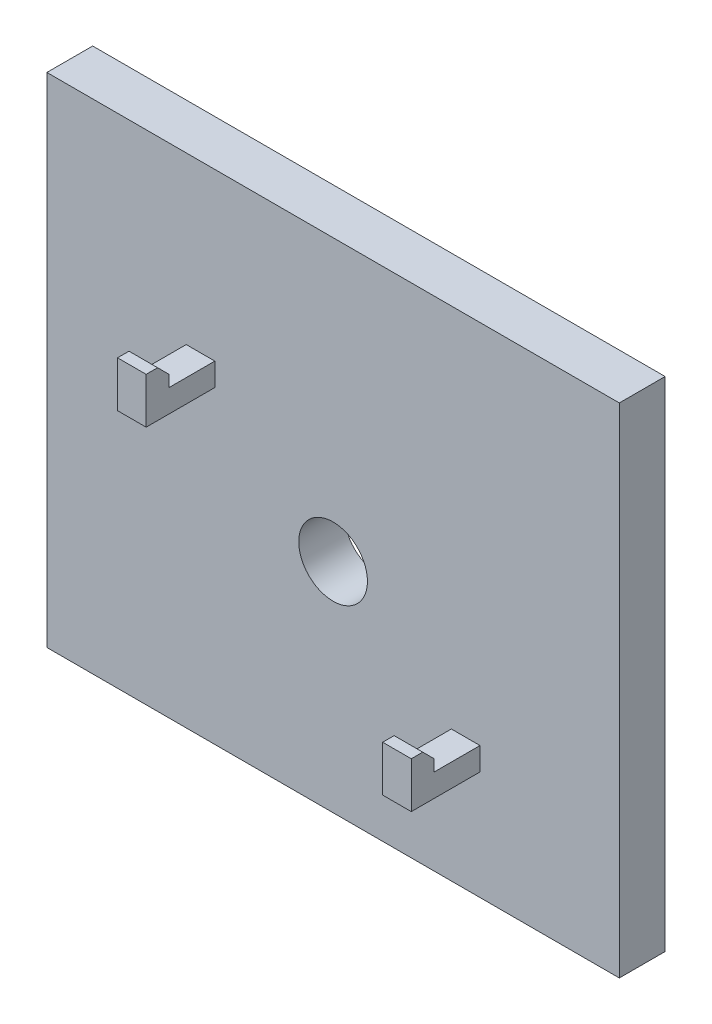
ISO-10303-21;
HEADER;
FILE_DESCRIPTION(('STEP AP214'),'2;1');
FILE_NAME('part.step','',(''),(''),'','','');
FILE_SCHEMA(('AUTOMOTIVE_DESIGN { 1 0 10303 214 1 1 1 1 }'));
ENDSEC;
DATA;
#1=APPLICATION_CONTEXT('core data for automotive mechanical design processes');
#2=APPLICATION_PROTOCOL_DEFINITION('international standard','automotive_design',2000,#1);
#3=PRODUCT_CONTEXT('',#1,'mechanical');
#4=PRODUCT('Part','Part','',(#3));
#5=PRODUCT_RELATED_PRODUCT_CATEGORY('part','',(#4));
#6=PRODUCT_DEFINITION_FORMATION('','',#4);
#7=PRODUCT_DEFINITION_CONTEXT('part definition',#1,'design');
#8=PRODUCT_DEFINITION('design','',#6,#7);
#9=PRODUCT_DEFINITION_SHAPE('','',#8);
#10=(LENGTH_UNIT() NAMED_UNIT(*) SI_UNIT(.MILLI.,.METRE.));
#11=(NAMED_UNIT(*) PLANE_ANGLE_UNIT() SI_UNIT($,.RADIAN.));
#12=(NAMED_UNIT(*) SI_UNIT($,.STERADIAN.) SOLID_ANGLE_UNIT());
#13=UNCERTAINTY_MEASURE_WITH_UNIT(LENGTH_MEASURE(1.E-05),#10,'distance_accuracy_value','');
#14=(GEOMETRIC_REPRESENTATION_CONTEXT(3) GLOBAL_UNCERTAINTY_ASSIGNED_CONTEXT((#13)) GLOBAL_UNIT_ASSIGNED_CONTEXT((#10,
#11,#12)) REPRESENTATION_CONTEXT('',''));
#15=CARTESIAN_POINT('',(0.,0.,0.));
#16=DIRECTION('',(0.,0.,1.));
#17=DIRECTION('',(1.,0.,0.));
#18=AXIS2_PLACEMENT_3D('',#15,#16,#17);
#19=CARTESIAN_POINT('',(12.83,-10.25,10.));
#20=DIRECTION('',(0.,-1.,0.));
#21=DIRECTION('',(0.,0.,-1.));
#22=AXIS2_PLACEMENT_3D('',#19,#20,#21);
#23=PLANE('',#22);
#24=DIRECTION('',(-1.,0.,0.));
#25=VECTOR('',#24,1.);
#26=CARTESIAN_POINT('',(10.33,-10.25,8.));
#27=LINE('',#26,#25);
#28=CARTESIAN_POINT('',(12.83,-10.25,8.));
#29=VERTEX_POINT('',#28);
#30=CARTESIAN_POINT('',(10.33,-10.25,8.));
#31=VERTEX_POINT('',#30);
#32=EDGE_CURVE('E167',#29,#31,#27,.T.);
#33=ORIENTED_EDGE('',*,*,#32,.F.);
#34=DIRECTION('',(0.,0.,-1.));
#35=VECTOR('',#34,1.);
#36=CARTESIAN_POINT('',(12.83,-10.25,10.));
#37=LINE('',#36,#35);
#38=CARTESIAN_POINT('',(12.83,-10.25,4.));
#39=VERTEX_POINT('',#38);
#40=EDGE_CURVE('E226',#29,#39,#37,.T.);
#41=ORIENTED_EDGE('',*,*,#40,.T.);
#42=DIRECTION('',(-1.,0.,0.));
#43=VECTOR('',#42,1.);
#44=CARTESIAN_POINT('',(12.83,-10.25,4.));
#45=LINE('',#44,#43);
#46=CARTESIAN_POINT('',(10.33,-10.25,4.));
#47=VERTEX_POINT('',#46);
#48=EDGE_CURVE('E214',#39,#47,#45,.T.);
#49=ORIENTED_EDGE('',*,*,#48,.T.);
#50=DIRECTION('',(0.,0.,-1.));
#51=VECTOR('',#50,1.);
#52=CARTESIAN_POINT('',(10.33,-10.25,10.));
#53=LINE('',#52,#51);
#54=EDGE_CURVE('E224',#31,#47,#53,.T.);
#55=ORIENTED_EDGE('',*,*,#54,.F.);
#56=EDGE_LOOP('',(#33,#41,#49,#55));
#57=FACE_BOUND('',#56,.T.);
#58=ADVANCED_FACE('F33',(#57),#23,.F.);
#59=CARTESIAN_POINT('',(-12.83,7.25,10.));
#60=DIRECTION('',(0.,-1.,0.));
#61=DIRECTION('',(0.,0.,-1.));
#62=AXIS2_PLACEMENT_3D('',#59,#60,#61);
#63=PLANE('',#62);
#64=DIRECTION('',(-1.,0.,0.));
#65=VECTOR('',#64,1.);
#66=CARTESIAN_POINT('',(-12.83,7.25,8.));
#67=LINE('',#66,#65);
#68=CARTESIAN_POINT('',(-10.33,7.25,8.));
#69=VERTEX_POINT('',#68);
#70=CARTESIAN_POINT('',(-12.83,7.25,8.));
#71=VERTEX_POINT('',#70);
#72=EDGE_CURVE('E192',#69,#71,#67,.T.);
#73=ORIENTED_EDGE('',*,*,#72,.F.);
#74=DIRECTION('',(0.,0.,-1.));
#75=VECTOR('',#74,1.);
#76=CARTESIAN_POINT('',(-10.33,7.25,10.));
#77=LINE('',#76,#75);
#78=CARTESIAN_POINT('',(-10.33,7.25,4.));
#79=VERTEX_POINT('',#78);
#80=EDGE_CURVE('E254',#69,#79,#77,.T.);
#81=ORIENTED_EDGE('',*,*,#80,.T.);
#82=DIRECTION('',(-1.,0.,0.));
#83=VECTOR('',#82,1.);
#84=CARTESIAN_POINT('',(-12.83,7.25,4.));
#85=LINE('',#84,#83);
#86=CARTESIAN_POINT('',(-12.83,7.25,4.));
#87=VERTEX_POINT('',#86);
#88=EDGE_CURVE('E239',#79,#87,#85,.T.);
#89=ORIENTED_EDGE('',*,*,#88,.T.);
#90=DIRECTION('',(0.,0.,-1.));
#91=VECTOR('',#90,1.);
#92=CARTESIAN_POINT('',(-12.83,7.25,10.));
#93=LINE('',#92,#91);
#94=EDGE_CURVE('E252',#71,#87,#93,.T.);
#95=ORIENTED_EDGE('',*,*,#94,.F.);
#96=EDGE_LOOP('',(#73,#81,#89,#95));
#97=FACE_BOUND('',#96,.T.);
#98=ADVANCED_FACE('F326',(#97),#63,.F.);
#99=CARTESIAN_POINT('',(0.,0.,4.));
#100=DIRECTION('',(0.,0.,-1.));
#101=DIRECTION('',(-1.,0.,0.));
#102=AXIS2_PLACEMENT_3D('',#99,#100,#101);
#103=PLANE('',#102);
#104=DIRECTION('',(0.,1.,0.));
#105=VECTOR('',#104,1.);
#106=CARTESIAN_POINT('',(-10.33,5.25,4.));
#107=LINE('',#106,#105);
#108=CARTESIAN_POINT('',(-10.33,5.25,4.));
#109=VERTEX_POINT('',#108);
#110=EDGE_CURVE('E228',#109,#79,#107,.T.);
#111=ORIENTED_EDGE('',*,*,#110,.F.);
#112=DIRECTION('',(1.,0.,0.));
#113=VECTOR('',#112,1.);
#114=CARTESIAN_POINT('',(-12.83,5.25,4.));
#115=LINE('',#114,#113);
#116=CARTESIAN_POINT('',(-12.83,5.25,4.));
#117=VERTEX_POINT('',#116);
#118=EDGE_CURVE('E232',#117,#109,#115,.T.);
#119=ORIENTED_EDGE('',*,*,#118,.F.);
#120=DIRECTION('',(0.,-1.,0.));
#121=VECTOR('',#120,1.);
#122=CARTESIAN_POINT('',(-12.83,5.25,4.));
#123=LINE('',#122,#121);
#124=EDGE_CURVE('E242',#87,#117,#123,.T.);
#125=ORIENTED_EDGE('',*,*,#124,.F.);
#126=ORIENTED_EDGE('',*,*,#88,.F.);
#127=EDGE_LOOP('',(#111,#119,#125,#126));
#128=FACE_BOUND('',#127,.T.);
#129=CARTESIAN_POINT('',(0.,-2.75,4.));
#130=DIRECTION('',(0.,0.,1.));
#131=DIRECTION('',(1.,0.,0.));
#132=AXIS2_PLACEMENT_3D('',#129,#130,#131);
#133=CIRCLE('',#132,3.);
#134=CARTESIAN_POINT('',(3.,-2.75,4.));
#135=VERTEX_POINT('',#134);
#136=EDGE_CURVE('E256',#135,#135,#133,.T.);
#137=ORIENTED_EDGE('',*,*,#136,.F.);
#138=EDGE_LOOP('',(#137));
#139=FACE_BOUND('',#138,.T.);
#140=DIRECTION('',(0.,1.,0.));
#141=VECTOR('',#140,1.);
#142=CARTESIAN_POINT('',(25.,-21.75,4.));
#143=LINE('',#142,#141);
#144=CARTESIAN_POINT('',(25.,-21.75,4.));
#145=VERTEX_POINT('',#144);
#146=CARTESIAN_POINT('',(25.,21.75,4.));
#147=VERTEX_POINT('',#146);
#148=EDGE_CURVE('E263',#145,#147,#143,.T.);
#149=ORIENTED_EDGE('',*,*,#148,.T.);
#150=DIRECTION('',(-1.,0.,0.));
#151=VECTOR('',#150,1.);
#152=CARTESIAN_POINT('',(-25.,21.75,4.));
#153=LINE('',#152,#151);
#154=CARTESIAN_POINT('',(-25.,21.75,4.));
#155=VERTEX_POINT('',#154);
#156=EDGE_CURVE('E266',#147,#155,#153,.T.);
#157=ORIENTED_EDGE('',*,*,#156,.T.);
#158=DIRECTION('',(0.,-1.,0.));
#159=VECTOR('',#158,1.);
#160=CARTESIAN_POINT('',(-25.,-21.75,4.));
#161=LINE('',#160,#159);
#162=CARTESIAN_POINT('',(-25.,-21.75,4.));
#163=VERTEX_POINT('',#162);
#164=EDGE_CURVE('E269',#155,#163,#161,.T.);
#165=ORIENTED_EDGE('',*,*,#164,.T.);
#166=DIRECTION('',(1.,0.,0.));
#167=VECTOR('',#166,1.);
#168=CARTESIAN_POINT('',(-25.,-21.75,4.));
#169=LINE('',#168,#167);
#170=EDGE_CURVE('E271',#163,#145,#169,.T.);
#171=ORIENTED_EDGE('',*,*,#170,.T.);
#172=EDGE_LOOP('',(#149,#157,#165,#171));
#173=FACE_BOUND('',#172,.T.);
#174=DIRECTION('',(0.,1.,0.));
#175=VECTOR('',#174,1.);
#176=CARTESIAN_POINT('',(12.83,-12.25,4.));
#177=LINE('',#176,#175);
#178=CARTESIAN_POINT('',(12.83,-12.25,4.));
#179=VERTEX_POINT('',#178);
#180=EDGE_CURVE('E207',#179,#39,#177,.T.);
#181=ORIENTED_EDGE('',*,*,#180,.F.);
#182=DIRECTION('',(1.,0.,0.));
#183=VECTOR('',#182,1.);
#184=CARTESIAN_POINT('',(12.83,-12.25,4.));
#185=LINE('',#184,#183);
#186=CARTESIAN_POINT('',(10.33,-12.25,4.));
#187=VERTEX_POINT('',#186);
#188=EDGE_CURVE('E208',#187,#179,#185,.T.);
#189=ORIENTED_EDGE('',*,*,#188,.F.);
#190=DIRECTION('',(0.,-1.,0.));
#191=VECTOR('',#190,1.);
#192=CARTESIAN_POINT('',(10.33,-12.25,4.));
#193=LINE('',#192,#191);
#194=EDGE_CURVE('E217',#47,#187,#193,.T.);
#195=ORIENTED_EDGE('',*,*,#194,.F.);
#196=ORIENTED_EDGE('',*,*,#48,.F.);
#197=EDGE_LOOP('',(#181,#189,#195,#196));
#198=FACE_BOUND('',#197,.T.);
#199=ADVANCED_FACE('F332',(#128,#139,#173,#198),#103,.F.);
#200=CARTESIAN_POINT('',(25.,-21.75,4.));
#201=DIRECTION('',(-1.,0.,0.));
#202=DIRECTION('',(0.,0.,1.));
#203=AXIS2_PLACEMENT_3D('',#200,#201,#202);
#204=PLANE('',#203);
#205=DIRECTION('',(0.,1.,0.));
#206=VECTOR('',#205,1.);
#207=CARTESIAN_POINT('',(25.,-21.75,0.));
#208=LINE('',#207,#206);
#209=CARTESIAN_POINT('',(25.,-21.75,0.));
#210=VERTEX_POINT('',#209);
#211=CARTESIAN_POINT('',(25.,21.75,0.));
#212=VERTEX_POINT('',#211);
#213=EDGE_CURVE('E260',#210,#212,#208,.T.);
#214=ORIENTED_EDGE('',*,*,#213,.T.);
#215=DIRECTION('',(0.,0.,-1.));
#216=VECTOR('',#215,1.);
#217=CARTESIAN_POINT('',(25.,21.75,4.));
#218=LINE('',#217,#216);
#219=EDGE_CURVE('E289',#147,#212,#218,.T.);
#220=ORIENTED_EDGE('',*,*,#219,.F.);
#221=ORIENTED_EDGE('',*,*,#148,.F.);
#222=DIRECTION('',(0.,0.,-1.));
#223=VECTOR('',#222,1.);
#224=CARTESIAN_POINT('',(25.,-21.75,4.));
#225=LINE('',#224,#223);
#226=EDGE_CURVE('E273',#145,#210,#225,.T.);
#227=ORIENTED_EDGE('',*,*,#226,.T.);
#228=EDGE_LOOP('',(#214,#220,#221,#227));
#229=FACE_BOUND('',#228,.T.);
#230=ADVANCED_FACE('F360',(#229),#204,.F.);
#231=CARTESIAN_POINT('',(-25.,21.75,4.));
#232=DIRECTION('',(0.,-1.,0.));
#233=DIRECTION('',(0.,0.,-1.));
#234=AXIS2_PLACEMENT_3D('',#231,#232,#233);
#235=PLANE('',#234);
#236=DIRECTION('',(-1.,0.,0.));
#237=VECTOR('',#236,1.);
#238=CARTESIAN_POINT('',(-25.,21.75,0.));
#239=LINE('',#238,#237);
#240=CARTESIAN_POINT('',(-25.,21.75,0.));
#241=VERTEX_POINT('',#240);
#242=EDGE_CURVE('E276',#212,#241,#239,.T.);
#243=ORIENTED_EDGE('',*,*,#242,.T.);
#244=DIRECTION('',(0.,0.,-1.));
#245=VECTOR('',#244,1.);
#246=CARTESIAN_POINT('',(-25.,21.75,4.));
#247=LINE('',#246,#245);
#248=EDGE_CURVE('E286',#155,#241,#247,.T.);
#249=ORIENTED_EDGE('',*,*,#248,.F.);
#250=ORIENTED_EDGE('',*,*,#156,.F.);
#251=ORIENTED_EDGE('',*,*,#219,.T.);
#252=EDGE_LOOP('',(#243,#249,#250,#251));
#253=FACE_BOUND('',#252,.T.);
#254=ADVANCED_FACE('F372',(#253),#235,.F.);
#255=CARTESIAN_POINT('',(-25.,-21.75,4.));
#256=DIRECTION('',(1.,0.,0.));
#257=DIRECTION('',(0.,0.,-1.));
#258=AXIS2_PLACEMENT_3D('',#255,#256,#257);
#259=PLANE('',#258);
#260=DIRECTION('',(0.,-1.,0.));
#261=VECTOR('',#260,1.);
#262=CARTESIAN_POINT('',(-25.,-21.75,0.));
#263=LINE('',#262,#261);
#264=CARTESIAN_POINT('',(-25.,-21.75,0.));
#265=VERTEX_POINT('',#264);
#266=EDGE_CURVE('E278',#241,#265,#263,.T.);
#267=ORIENTED_EDGE('',*,*,#266,.T.);
#268=DIRECTION('',(0.,0.,-1.));
#269=VECTOR('',#268,1.);
#270=CARTESIAN_POINT('',(-25.,-21.75,4.));
#271=LINE('',#270,#269);
#272=EDGE_CURVE('E283',#163,#265,#271,.T.);
#273=ORIENTED_EDGE('',*,*,#272,.F.);
#274=ORIENTED_EDGE('',*,*,#164,.F.);
#275=ORIENTED_EDGE('',*,*,#248,.T.);
#276=EDGE_LOOP('',(#267,#273,#274,#275));
#277=FACE_BOUND('',#276,.T.);
#278=ADVANCED_FACE('F368',(#277),#259,.F.);
#279=CARTESIAN_POINT('',(-25.,-21.75,4.));
#280=DIRECTION('',(0.,1.,0.));
#281=DIRECTION('',(0.,0.,1.));
#282=AXIS2_PLACEMENT_3D('',#279,#280,#281);
#283=PLANE('',#282);
#284=DIRECTION('',(1.,0.,0.));
#285=VECTOR('',#284,1.);
#286=CARTESIAN_POINT('',(-25.,-21.75,0.));
#287=LINE('',#286,#285);
#288=EDGE_CURVE('E267',#265,#210,#287,.T.);
#289=ORIENTED_EDGE('',*,*,#288,.T.);
#290=ORIENTED_EDGE('',*,*,#226,.F.);
#291=ORIENTED_EDGE('',*,*,#170,.F.);
#292=ORIENTED_EDGE('',*,*,#272,.T.);
#293=EDGE_LOOP('',(#289,#290,#291,#292));
#294=FACE_BOUND('',#293,.T.);
#295=ADVANCED_FACE('F364',(#294),#283,.F.);
#296=CARTESIAN_POINT('',(0.,0.,0.));
#297=DIRECTION('',(0.,0.,-1.));
#298=DIRECTION('',(-1.,0.,0.));
#299=AXIS2_PLACEMENT_3D('',#296,#297,#298);
#300=PLANE('',#299);
#301=CARTESIAN_POINT('',(0.,-2.75,0.));
#302=DIRECTION('',(0.,0.,1.));
#303=DIRECTION('',(1.,0.,0.));
#304=AXIS2_PLACEMENT_3D('',#301,#302,#303);
#305=CIRCLE('',#304,3.);
#306=CARTESIAN_POINT('',(3.,-2.75,0.));
#307=VERTEX_POINT('',#306);
#308=EDGE_CURVE('E257',#307,#307,#305,.T.);
#309=ORIENTED_EDGE('',*,*,#308,.T.);
#310=EDGE_LOOP('',(#309));
#311=FACE_BOUND('',#310,.T.);
#312=ORIENTED_EDGE('',*,*,#213,.F.);
#313=ORIENTED_EDGE('',*,*,#288,.F.);
#314=ORIENTED_EDGE('',*,*,#266,.F.);
#315=ORIENTED_EDGE('',*,*,#242,.F.);
#316=EDGE_LOOP('',(#312,#313,#314,#315));
#317=FACE_BOUND('',#316,.T.);
#318=ADVANCED_FACE('F356',(#311,#317),#300,.T.);
#319=CARTESIAN_POINT('',(0.,-2.75,0.));
#320=DIRECTION('',(0.,0.,1.));
#321=DIRECTION('',(1.,0.,0.));
#322=AXIS2_PLACEMENT_3D('',#319,#320,#321);
#323=CYLINDRICAL_SURFACE('',#322,3.);
#324=ORIENTED_EDGE('',*,*,#308,.F.);
#325=EDGE_LOOP('',(#324));
#326=FACE_BOUND('',#325,.T.);
#327=ORIENTED_EDGE('',*,*,#136,.T.);
#328=EDGE_LOOP('',(#327));
#329=FACE_BOUND('',#328,.T.);
#330=ADVANCED_FACE('F353',(#326,#329),#323,.F.);
#331=CARTESIAN_POINT('',(-10.33,5.25,10.));
#332=DIRECTION('',(-1.,0.,0.));
#333=DIRECTION('',(0.,0.,1.));
#334=AXIS2_PLACEMENT_3D('',#331,#332,#333);
#335=PLANE('',#334);
#336=DIRECTION('',(0.,-1.,0.));
#337=VECTOR('',#336,1.);
#338=CARTESIAN_POINT('',(-10.33,9.25,8.));
#339=LINE('',#338,#337);
#340=CARTESIAN_POINT('',(-10.33,8.24999999999998,8.));
#341=VERTEX_POINT('',#340);
#342=EDGE_CURVE('E205',#341,#69,#339,.T.);
#343=ORIENTED_EDGE('',*,*,#342,.F.);
#344=DIRECTION('',(0.,-0.707106781186552,-0.707106781186543));
#345=VECTOR('',#344,1.);
#346=CARTESIAN_POINT('',(-10.33,9.25,9.));
#347=LINE('',#346,#345);
#348=CARTESIAN_POINT('',(-10.33,9.25,9.));
#349=VERTEX_POINT('',#348);
#350=EDGE_CURVE('E11',#341,#349,#347,.F.);
#351=ORIENTED_EDGE('',*,*,#350,.T.);
#352=DIRECTION('',(0.,0.,-1.));
#353=VECTOR('',#352,1.);
#354=CARTESIAN_POINT('',(-10.33,9.25,10.));
#355=LINE('',#354,#353);
#356=CARTESIAN_POINT('',(-10.33,9.25,10.));
#357=VERTEX_POINT('',#356);
#358=EDGE_CURVE('E198',#357,#349,#355,.T.);
#359=ORIENTED_EDGE('',*,*,#358,.F.);
#360=DIRECTION('',(0.,1.,0.));
#361=VECTOR('',#360,1.);
#362=CARTESIAN_POINT('',(-10.33,5.25,10.));
#363=LINE('',#362,#361);
#364=CARTESIAN_POINT('',(-10.33,5.25,10.));
#365=VERTEX_POINT('',#364);
#366=EDGE_CURVE('E229',#365,#357,#363,.T.);
#367=ORIENTED_EDGE('',*,*,#366,.F.);
#368=DIRECTION('',(0.,0.,-1.));
#369=VECTOR('',#368,1.);
#370=CARTESIAN_POINT('',(-10.33,5.25,10.));
#371=LINE('',#370,#369);
#372=EDGE_CURVE('E236',#365,#109,#371,.T.);
#373=ORIENTED_EDGE('',*,*,#372,.T.);
#374=ORIENTED_EDGE('',*,*,#110,.T.);
#375=ORIENTED_EDGE('',*,*,#80,.F.);
#376=EDGE_LOOP('',(#343,#351,#359,#367,#373,#374,#375));
#377=FACE_BOUND('',#376,.T.);
#378=ADVANCED_FACE('F317',(#377),#335,.F.);
#379=CARTESIAN_POINT('',(-12.83,5.25,10.));
#380=DIRECTION('',(1.,0.,0.));
#381=DIRECTION('',(0.,0.,-1.));
#382=AXIS2_PLACEMENT_3D('',#379,#380,#381);
#383=PLANE('',#382);
#384=DIRECTION('',(0.,0.,1.));
#385=VECTOR('',#384,1.);
#386=CARTESIAN_POINT('',(-12.83,9.25,10.));
#387=LINE('',#386,#385);
#388=CARTESIAN_POINT('',(-12.83,9.25,9.));
#389=VERTEX_POINT('',#388);
#390=CARTESIAN_POINT('',(-12.83,9.25,10.));
#391=VERTEX_POINT('',#390);
#392=EDGE_CURVE('E193',#389,#391,#387,.T.);
#393=ORIENTED_EDGE('',*,*,#392,.F.);
#394=DIRECTION('',(0.,0.707106781186552,0.707106781186543));
#395=VECTOR('',#394,1.);
#396=CARTESIAN_POINT('',(-12.83,9.25,9.));
#397=LINE('',#396,#395);
#398=CARTESIAN_POINT('',(-12.83,8.24999999999998,8.));
#399=VERTEX_POINT('',#398);
#400=EDGE_CURVE('E55',#389,#399,#397,.F.);
#401=ORIENTED_EDGE('',*,*,#400,.T.);
#402=DIRECTION('',(0.,-1.,0.));
#403=VECTOR('',#402,1.);
#404=CARTESIAN_POINT('',(-12.83,9.25,8.));
#405=LINE('',#404,#403);
#406=EDGE_CURVE('E201',#399,#71,#405,.T.);
#407=ORIENTED_EDGE('',*,*,#406,.T.);
#408=ORIENTED_EDGE('',*,*,#94,.T.);
#409=ORIENTED_EDGE('',*,*,#124,.T.);
#410=DIRECTION('',(0.,0.,-1.));
#411=VECTOR('',#410,1.);
#412=CARTESIAN_POINT('',(-12.83,5.25,10.));
#413=LINE('',#412,#411);
#414=CARTESIAN_POINT('',(-12.83,5.25,10.));
#415=VERTEX_POINT('',#414);
#416=EDGE_CURVE('E249',#415,#117,#413,.T.);
#417=ORIENTED_EDGE('',*,*,#416,.F.);
#418=DIRECTION('',(0.,-1.,0.));
#419=VECTOR('',#418,1.);
#420=CARTESIAN_POINT('',(-12.83,5.25,10.));
#421=LINE('',#420,#419);
#422=EDGE_CURVE('E231',#391,#415,#421,.T.);
#423=ORIENTED_EDGE('',*,*,#422,.F.);
#424=EDGE_LOOP('',(#393,#401,#407,#408,#409,#417,#423));
#425=FACE_BOUND('',#424,.T.);
#426=ADVANCED_FACE('F309',(#425),#383,.F.);
#427=CARTESIAN_POINT('',(-12.83,5.25,10.));
#428=DIRECTION('',(0.,1.,0.));
#429=DIRECTION('',(0.,0.,1.));
#430=AXIS2_PLACEMENT_3D('',#427,#428,#429);
#431=PLANE('',#430);
#432=ORIENTED_EDGE('',*,*,#118,.T.);
#433=ORIENTED_EDGE('',*,*,#372,.F.);
#434=DIRECTION('',(1.,0.,0.));
#435=VECTOR('',#434,1.);
#436=CARTESIAN_POINT('',(-12.83,5.25,10.));
#437=LINE('',#436,#435);
#438=EDGE_CURVE('E234',#415,#365,#437,.T.);
#439=ORIENTED_EDGE('',*,*,#438,.F.);
#440=ORIENTED_EDGE('',*,*,#416,.T.);
#441=EDGE_LOOP('',(#432,#433,#439,#440));
#442=FACE_BOUND('',#441,.T.);
#443=ADVANCED_FACE('F345',(#442),#431,.F.);
#444=CARTESIAN_POINT('',(0.,0.,10.));
#445=DIRECTION('',(0.,0.,-1.));
#446=DIRECTION('',(-1.,0.,0.));
#447=AXIS2_PLACEMENT_3D('',#444,#445,#446);
#448=PLANE('',#447);
#449=ORIENTED_EDGE('',*,*,#366,.T.);
#450=DIRECTION('',(1.,0.,0.));
#451=VECTOR('',#450,1.);
#452=CARTESIAN_POINT('',(-12.83,9.25,10.));
#453=LINE('',#452,#451);
#454=EDGE_CURVE('E195',#391,#357,#453,.T.);
#455=ORIENTED_EDGE('',*,*,#454,.F.);
#456=ORIENTED_EDGE('',*,*,#422,.T.);
#457=ORIENTED_EDGE('',*,*,#438,.T.);
#458=EDGE_LOOP('',(#449,#455,#456,#457));
#459=FACE_BOUND('',#458,.T.);
#460=ADVANCED_FACE('F314',(#459),#448,.F.);
#461=CARTESIAN_POINT('',(12.83,-12.25,10.));
#462=DIRECTION('',(-1.,0.,0.));
#463=DIRECTION('',(0.,0.,1.));
#464=AXIS2_PLACEMENT_3D('',#461,#462,#463);
#465=PLANE('',#464);
#466=DIRECTION('',(0.,-1.,0.));
#467=VECTOR('',#466,1.);
#468=CARTESIAN_POINT('',(12.83,-8.25,8.));
#469=LINE('',#468,#467);
#470=CARTESIAN_POINT('',(12.83,-9.25000000000002,8.));
#471=VERTEX_POINT('',#470);
#472=EDGE_CURVE('E190',#471,#29,#469,.T.);
#473=ORIENTED_EDGE('',*,*,#472,.F.);
#474=DIRECTION('',(0.,-0.707106781186552,-0.707106781186543));
#475=VECTOR('',#474,1.);
#476=CARTESIAN_POINT('',(12.83,-8.25,9.));
#477=LINE('',#476,#475);
#478=CARTESIAN_POINT('',(12.83,-8.25,9.));
#479=VERTEX_POINT('',#478);
#480=EDGE_CURVE('E297',#471,#479,#477,.F.);
#481=ORIENTED_EDGE('',*,*,#480,.T.);
#482=DIRECTION('',(0.,0.,-1.));
#483=VECTOR('',#482,1.);
#484=CARTESIAN_POINT('',(12.83,-8.25,10.));
#485=LINE('',#484,#483);
#486=CARTESIAN_POINT('',(12.83,-8.25,10.));
#487=VERTEX_POINT('',#486);
#488=EDGE_CURVE('E182',#487,#479,#485,.T.);
#489=ORIENTED_EDGE('',*,*,#488,.F.);
#490=DIRECTION('',(0.,1.,0.));
#491=VECTOR('',#490,1.);
#492=CARTESIAN_POINT('',(12.83,-12.25,10.));
#493=LINE('',#492,#491);
#494=CARTESIAN_POINT('',(12.83,-12.25,10.));
#495=VERTEX_POINT('',#494);
#496=EDGE_CURVE('E178',#495,#487,#493,.T.);
#497=ORIENTED_EDGE('',*,*,#496,.F.);
#498=DIRECTION('',(0.,0.,-1.));
#499=VECTOR('',#498,1.);
#500=CARTESIAN_POINT('',(12.83,-12.25,10.));
#501=LINE('',#500,#499);
#502=EDGE_CURVE('E211',#495,#179,#501,.T.);
#503=ORIENTED_EDGE('',*,*,#502,.T.);
#504=ORIENTED_EDGE('',*,*,#180,.T.);
#505=ORIENTED_EDGE('',*,*,#40,.F.);
#506=EDGE_LOOP('',(#473,#481,#489,#497,#503,#504,#505));
#507=FACE_BOUND('',#506,.T.);
#508=ADVANCED_FACE('F339',(#507),#465,.F.);
#509=CARTESIAN_POINT('',(10.33,-12.25,10.));
#510=DIRECTION('',(1.,0.,0.));
#511=DIRECTION('',(0.,0.,-1.));
#512=AXIS2_PLACEMENT_3D('',#509,#510,#511);
#513=PLANE('',#512);
#514=DIRECTION('',(0.,0.,1.));
#515=VECTOR('',#514,1.);
#516=CARTESIAN_POINT('',(10.33,-8.25,10.));
#517=LINE('',#516,#515);
#518=CARTESIAN_POINT('',(10.33,-8.25,9.));
#519=VERTEX_POINT('',#518);
#520=CARTESIAN_POINT('',(10.33,-8.25,10.));
#521=VERTEX_POINT('',#520);
#522=EDGE_CURVE('E157',#519,#521,#517,.T.);
#523=ORIENTED_EDGE('',*,*,#522,.F.);
#524=DIRECTION('',(0.,0.707106781186552,0.707106781186543));
#525=VECTOR('',#524,1.);
#526=CARTESIAN_POINT('',(10.33,-8.25,9.));
#527=LINE('',#526,#525);
#528=CARTESIAN_POINT('',(10.33,-9.25000000000002,8.));
#529=VERTEX_POINT('',#528);
#530=EDGE_CURVE('E293',#519,#529,#527,.F.);
#531=ORIENTED_EDGE('',*,*,#530,.T.);
#532=DIRECTION('',(0.,-1.,0.));
#533=VECTOR('',#532,1.);
#534=CARTESIAN_POINT('',(10.33,-8.25,8.));
#535=LINE('',#534,#533);
#536=EDGE_CURVE('E184',#529,#31,#535,.T.);
#537=ORIENTED_EDGE('',*,*,#536,.T.);
#538=ORIENTED_EDGE('',*,*,#54,.T.);
#539=ORIENTED_EDGE('',*,*,#194,.T.);
#540=DIRECTION('',(0.,0.,-1.));
#541=VECTOR('',#540,1.);
#542=CARTESIAN_POINT('',(10.33,-12.25,10.));
#543=LINE('',#542,#541);
#544=CARTESIAN_POINT('',(10.33,-12.25,10.));
#545=VERTEX_POINT('',#544);
#546=EDGE_CURVE('E174',#545,#187,#543,.T.);
#547=ORIENTED_EDGE('',*,*,#546,.F.);
#548=DIRECTION('',(0.,-1.,0.));
#549=VECTOR('',#548,1.);
#550=CARTESIAN_POINT('',(10.33,-12.25,10.));
#551=LINE('',#550,#549);
#552=EDGE_CURVE('E170',#521,#545,#551,.T.);
#553=ORIENTED_EDGE('',*,*,#552,.F.);
#554=EDGE_LOOP('',(#523,#531,#537,#538,#539,#547,#553));
#555=FACE_BOUND('',#554,.T.);
#556=ADVANCED_FACE('F171',(#555),#513,.F.);
#557=CARTESIAN_POINT('',(12.83,-12.25,10.));
#558=DIRECTION('',(0.,1.,0.));
#559=DIRECTION('',(0.,0.,1.));
#560=AXIS2_PLACEMENT_3D('',#557,#558,#559);
#561=PLANE('',#560);
#562=ORIENTED_EDGE('',*,*,#188,.T.);
#563=ORIENTED_EDGE('',*,*,#502,.F.);
#564=DIRECTION('',(1.,0.,0.));
#565=VECTOR('',#564,1.);
#566=CARTESIAN_POINT('',(12.83,-12.25,10.));
#567=LINE('',#566,#565);
#568=EDGE_CURVE('E177',#545,#495,#567,.T.);
#569=ORIENTED_EDGE('',*,*,#568,.F.);
#570=ORIENTED_EDGE('',*,*,#546,.T.);
#571=EDGE_LOOP('',(#562,#563,#569,#570));
#572=FACE_BOUND('',#571,.T.);
#573=ADVANCED_FACE('F399',(#572),#561,.F.);
#574=CARTESIAN_POINT('',(0.,0.,10.));
#575=DIRECTION('',(0.,0.,1.));
#576=DIRECTION('',(1.,0.,0.));
#577=AXIS2_PLACEMENT_3D('',#574,#575,#576);
#578=PLANE('',#577);
#579=ORIENTED_EDGE('',*,*,#496,.T.);
#580=DIRECTION('',(1.,0.,0.));
#581=VECTOR('',#580,1.);
#582=CARTESIAN_POINT('',(10.33,-8.25,10.));
#583=LINE('',#582,#581);
#584=EDGE_CURVE('E162',#521,#487,#583,.T.);
#585=ORIENTED_EDGE('',*,*,#584,.F.);
#586=ORIENTED_EDGE('',*,*,#552,.T.);
#587=ORIENTED_EDGE('',*,*,#568,.T.);
#588=EDGE_LOOP('',(#579,#585,#586,#587));
#589=FACE_BOUND('',#588,.T.);
#590=ADVANCED_FACE('F180',(#589),#578,.T.);
#591=CARTESIAN_POINT('',(-12.83,9.25,8.));
#592=DIRECTION('',(0.,0.,1.));
#593=DIRECTION('',(1.,0.,0.));
#594=AXIS2_PLACEMENT_3D('',#591,#592,#593);
#595=PLANE('',#594);
#596=ORIENTED_EDGE('',*,*,#406,.F.);
#597=DIRECTION('',(1.,0.,0.));
#598=VECTOR('',#597,1.);
#599=CARTESIAN_POINT('',(-12.83,8.24999999999998,8.));
#600=LINE('',#599,#598);
#601=EDGE_CURVE('E41',#399,#341,#600,.T.);
#602=ORIENTED_EDGE('',*,*,#601,.T.);
#603=ORIENTED_EDGE('',*,*,#342,.T.);
#604=ORIENTED_EDGE('',*,*,#72,.T.);
#605=EDGE_LOOP('',(#596,#602,#603,#604));
#606=FACE_BOUND('',#605,.T.);
#607=ADVANCED_FACE('F414',(#606),#595,.F.);
#608=CARTESIAN_POINT('',(0.,9.25,0.));
#609=DIRECTION('',(0.,-1.,0.));
#610=DIRECTION('',(0.,0.,-1.));
#611=AXIS2_PLACEMENT_3D('',#608,#609,#610);
#612=PLANE('',#611);
#613=ORIENTED_EDGE('',*,*,#358,.T.);
#614=DIRECTION('',(-1.,0.,0.));
#615=VECTOR('',#614,1.);
#616=CARTESIAN_POINT('',(0.,9.25,9.));
#617=LINE('',#616,#615);
#618=EDGE_CURVE('E299',#349,#389,#617,.T.);
#619=ORIENTED_EDGE('',*,*,#618,.T.);
#620=ORIENTED_EDGE('',*,*,#392,.T.);
#621=ORIENTED_EDGE('',*,*,#454,.T.);
#622=EDGE_LOOP('',(#613,#619,#620,#621));
#623=FACE_BOUND('',#622,.T.);
#624=ADVANCED_FACE('F304',(#623),#612,.F.);
#625=CARTESIAN_POINT('',(10.33,-8.25,8.));
#626=DIRECTION('',(0.,0.,1.));
#627=DIRECTION('',(1.,0.,0.));
#628=AXIS2_PLACEMENT_3D('',#625,#626,#627);
#629=PLANE('',#628);
#630=ORIENTED_EDGE('',*,*,#536,.F.);
#631=DIRECTION('',(1.,0.,0.));
#632=VECTOR('',#631,1.);
#633=CARTESIAN_POINT('',(10.33,-9.25000000000002,8.));
#634=LINE('',#633,#632);
#635=EDGE_CURVE('E295',#529,#471,#634,.T.);
#636=ORIENTED_EDGE('',*,*,#635,.T.);
#637=ORIENTED_EDGE('',*,*,#472,.T.);
#638=ORIENTED_EDGE('',*,*,#32,.T.);
#639=EDGE_LOOP('',(#630,#636,#637,#638));
#640=FACE_BOUND('',#639,.T.);
#641=ADVANCED_FACE('F405',(#640),#629,.F.);
#642=CARTESIAN_POINT('',(0.,-8.25,0.));
#643=DIRECTION('',(0.,-1.,0.));
#644=DIRECTION('',(0.,0.,-1.));
#645=AXIS2_PLACEMENT_3D('',#642,#643,#644);
#646=PLANE('',#645);
#647=ORIENTED_EDGE('',*,*,#488,.T.);
#648=DIRECTION('',(-1.,0.,0.));
#649=VECTOR('',#648,1.);
#650=CARTESIAN_POINT('',(0.,-8.25,9.));
#651=LINE('',#650,#649);
#652=EDGE_CURVE('E165',#479,#519,#651,.T.);
#653=ORIENTED_EDGE('',*,*,#652,.T.);
#654=ORIENTED_EDGE('',*,*,#522,.T.);
#655=ORIENTED_EDGE('',*,*,#584,.T.);
#656=EDGE_LOOP('',(#647,#653,#654,#655));
#657=FACE_BOUND('',#656,.T.);
#658=ADVANCED_FACE('F160',(#657),#646,.F.);
#659=CARTESIAN_POINT('',(0.,-8.25,9.));
#660=DIRECTION('',(0.,-0.707106781186542,0.707106781186552));
#661=DIRECTION('',(-1.,0.,0.));
#662=AXIS2_PLACEMENT_3D('',#659,#660,#661);
#663=PLANE('',#662);
#664=ORIENTED_EDGE('',*,*,#480,.F.);
#665=ORIENTED_EDGE('',*,*,#635,.F.);
#666=ORIENTED_EDGE('',*,*,#530,.F.);
#667=ORIENTED_EDGE('',*,*,#652,.F.);
#668=EDGE_LOOP('',(#664,#665,#666,#667));
#669=FACE_BOUND('',#668,.T.);
#670=ADVANCED_FACE('F320',(#669),#663,.F.);
#671=CARTESIAN_POINT('',(0.,9.25,9.));
#672=DIRECTION('',(0.,-0.707106781186542,0.707106781186552));
#673=DIRECTION('',(-1.,0.,0.));
#674=AXIS2_PLACEMENT_3D('',#671,#672,#673);
#675=PLANE('',#674);
#676=ORIENTED_EDGE('',*,*,#350,.F.);
#677=ORIENTED_EDGE('',*,*,#601,.F.);
#678=ORIENTED_EDGE('',*,*,#400,.F.);
#679=ORIENTED_EDGE('',*,*,#618,.F.);
#680=EDGE_LOOP('',(#676,#677,#678,#679));
#681=FACE_BOUND('',#680,.T.);
#682=ADVANCED_FACE('F35',(#681),#675,.F.);
#683=CLOSED_SHELL('',(#58,#98,#199,#230,#254,#278,#295,#318,#330,#378,#426,#443,#460,#508,#556,
#573,#590,#607,#624,#641,#658,#670,#682));
#684=MANIFOLD_SOLID_BREP('B2',#683);
#685=ADVANCED_BREP_SHAPE_REPRESENTATION('',(#18,#684),#14);
#686=SHAPE_DEFINITION_REPRESENTATION(#9,#685);
ENDSEC;
END-ISO-10303-21;
